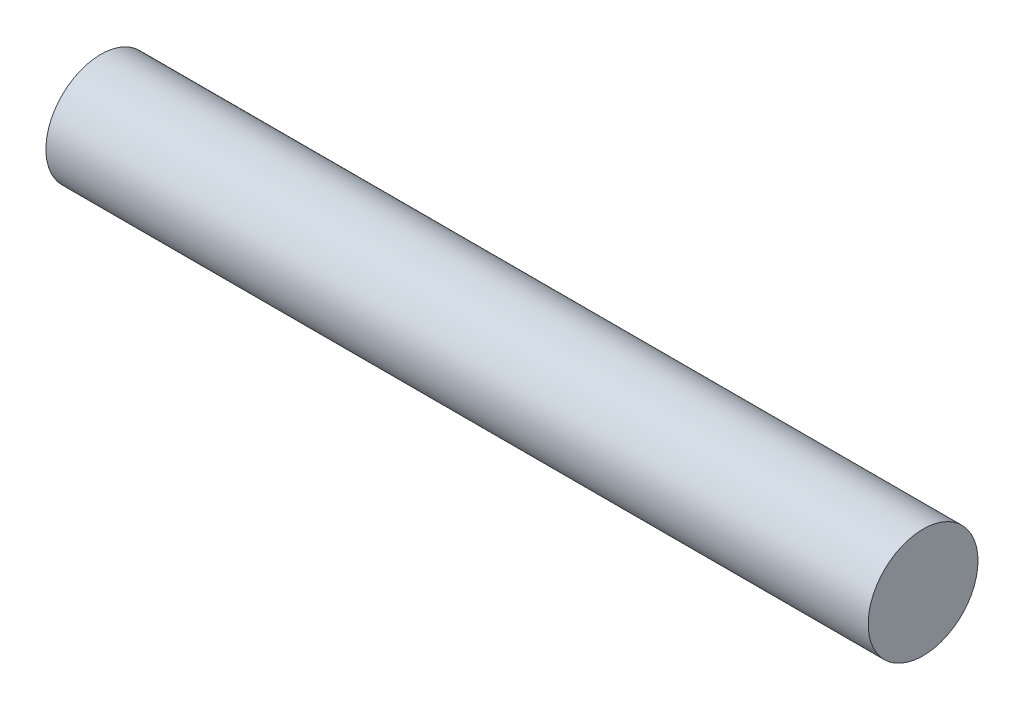
ISO-10303-21;
HEADER;
FILE_DESCRIPTION(('STEP AP214'),'2;1');
FILE_NAME('part.step','',(''),(''),'','','');
FILE_SCHEMA(('AUTOMOTIVE_DESIGN { 1 0 10303 214 1 1 1 1 }'));
ENDSEC;
DATA;
#1=APPLICATION_CONTEXT('core data for automotive mechanical design processes');
#2=APPLICATION_PROTOCOL_DEFINITION('international standard','automotive_design',2000,#1);
#3=PRODUCT_CONTEXT('',#1,'mechanical');
#4=PRODUCT('Part','Part','',(#3));
#5=PRODUCT_RELATED_PRODUCT_CATEGORY('part','',(#4));
#6=PRODUCT_DEFINITION_FORMATION('','',#4);
#7=PRODUCT_DEFINITION_CONTEXT('part definition',#1,'design');
#8=PRODUCT_DEFINITION('design','',#6,#7);
#9=PRODUCT_DEFINITION_SHAPE('','',#8);
#10=(LENGTH_UNIT() NAMED_UNIT(*) SI_UNIT(.MILLI.,.METRE.));
#11=(NAMED_UNIT(*) PLANE_ANGLE_UNIT() SI_UNIT($,.RADIAN.));
#12=(NAMED_UNIT(*) SI_UNIT($,.STERADIAN.) SOLID_ANGLE_UNIT());
#13=UNCERTAINTY_MEASURE_WITH_UNIT(LENGTH_MEASURE(1.E-05),#10,'distance_accuracy_value','');
#14=(GEOMETRIC_REPRESENTATION_CONTEXT(3) GLOBAL_UNCERTAINTY_ASSIGNED_CONTEXT((#13)) GLOBAL_UNIT_ASSIGNED_CONTEXT((#10,
#11,#12)) REPRESENTATION_CONTEXT('',''));
#15=CARTESIAN_POINT('',(0.,0.,0.));
#16=DIRECTION('',(0.,0.,1.));
#17=DIRECTION('',(1.,0.,0.));
#18=AXIS2_PLACEMENT_3D('',#15,#16,#17);
#19=CARTESIAN_POINT('',(0.,0.,0.));
#20=DIRECTION('',(1.,0.,0.));
#21=DIRECTION('',(0.,0.,-1.));
#22=AXIS2_PLACEMENT_3D('',#19,#20,#21);
#23=PLANE('',#22);
#24=CARTESIAN_POINT('',(0.,0.,0.));
#25=DIRECTION('',(1.,0.,0.));
#26=DIRECTION('',(0.,0.,-1.));
#27=AXIS2_PLACEMENT_3D('',#24,#25,#26);
#28=CIRCLE('',#27,20.);
#29=CARTESIAN_POINT('',(0.,0.,-20.));
#30=VERTEX_POINT('',#29);
#31=EDGE_CURVE('E57',#30,#30,#28,.T.);
#32=ORIENTED_EDGE('',*,*,#31,.F.);
#33=EDGE_LOOP('',(#32));
#34=FACE_BOUND('',#33,.T.);
#35=ADVANCED_FACE('F50',(#34),#23,.F.);
#36=CARTESIAN_POINT('',(299.496862108922,0.,0.));
#37=DIRECTION('',(1.,0.,0.));
#38=DIRECTION('',(0.,0.,-1.));
#39=AXIS2_PLACEMENT_3D('',#36,#37,#38);
#40=PLANE('',#39);
#41=CARTESIAN_POINT('',(299.496862108922,0.,0.));
#42=DIRECTION('',(1.,0.,0.));
#43=DIRECTION('',(0.,0.,-1.));
#44=AXIS2_PLACEMENT_3D('',#41,#42,#43);
#45=CIRCLE('',#44,20.);
#46=CARTESIAN_POINT('',(299.496862108922,0.,-20.));
#47=VERTEX_POINT('',#46);
#48=EDGE_CURVE('E11',#47,#47,#45,.T.);
#49=ORIENTED_EDGE('',*,*,#48,.T.);
#50=EDGE_LOOP('',(#49));
#51=FACE_BOUND('',#50,.T.);
#52=ADVANCED_FACE('F66',(#51),#40,.T.);
#53=CARTESIAN_POINT('',(0.,0.,0.));
#54=DIRECTION('',(1.,0.,0.));
#55=DIRECTION('',(0.,0.,-1.));
#56=AXIS2_PLACEMENT_3D('',#53,#54,#55);
#57=CYLINDRICAL_SURFACE('',#56,20.);
#58=ORIENTED_EDGE('',*,*,#48,.F.);
#59=EDGE_LOOP('',(#58));
#60=FACE_BOUND('',#59,.T.);
#61=ORIENTED_EDGE('',*,*,#31,.T.);
#62=EDGE_LOOP('',(#61));
#63=FACE_BOUND('',#62,.T.);
#64=ADVANCED_FACE('F63',(#60,#63),#57,.T.);
#65=CLOSED_SHELL('',(#35,#52,#64));
#66=MANIFOLD_SOLID_BREP('B2',#65);
#67=ADVANCED_BREP_SHAPE_REPRESENTATION('',(#18,#66),#14);
#68=SHAPE_DEFINITION_REPRESENTATION(#9,#67);
ENDSEC;
END-ISO-10303-21;
